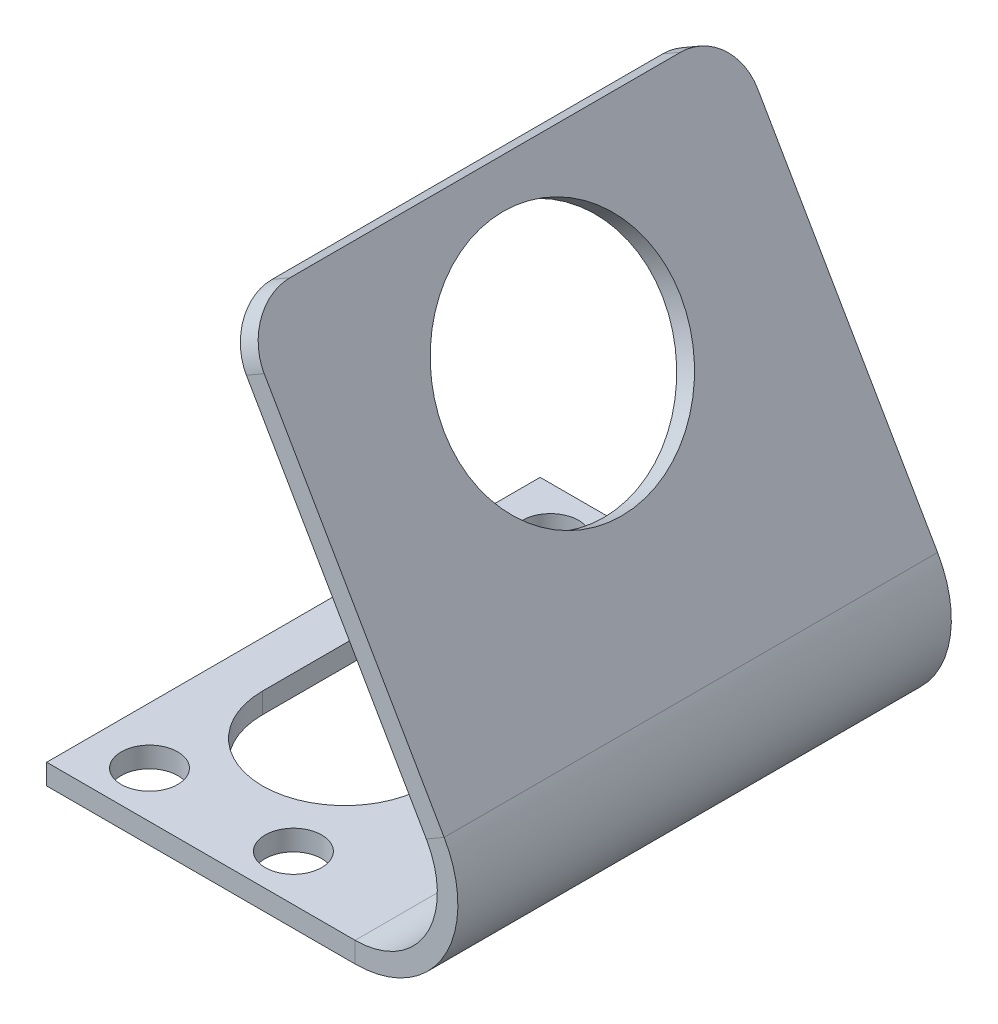
ISO-10303-21;
HEADER;
FILE_DESCRIPTION(('STEP AP214'),'2;1');
FILE_NAME('part.step','',(''),(''),'','','');
FILE_SCHEMA(('AUTOMOTIVE_DESIGN { 1 0 10303 214 1 1 1 1 }'));
ENDSEC;
DATA;
#1=APPLICATION_CONTEXT('core data for automotive mechanical design processes');
#2=APPLICATION_PROTOCOL_DEFINITION('international standard','automotive_design',2000,#1);
#3=PRODUCT_CONTEXT('',#1,'mechanical');
#4=PRODUCT('Part','Part','',(#3));
#5=PRODUCT_RELATED_PRODUCT_CATEGORY('part','',(#4));
#6=PRODUCT_DEFINITION_FORMATION('','',#4);
#7=PRODUCT_DEFINITION_CONTEXT('part definition',#1,'design');
#8=PRODUCT_DEFINITION('design','',#6,#7);
#9=PRODUCT_DEFINITION_SHAPE('','',#8);
#10=(LENGTH_UNIT() NAMED_UNIT(*) SI_UNIT(.MILLI.,.METRE.));
#11=(NAMED_UNIT(*) PLANE_ANGLE_UNIT() SI_UNIT($,.RADIAN.));
#12=(NAMED_UNIT(*) SI_UNIT($,.STERADIAN.) SOLID_ANGLE_UNIT());
#13=UNCERTAINTY_MEASURE_WITH_UNIT(LENGTH_MEASURE(1.E-05),#10,'distance_accuracy_value','');
#14=(GEOMETRIC_REPRESENTATION_CONTEXT(3) GLOBAL_UNCERTAINTY_ASSIGNED_CONTEXT((#13)) GLOBAL_UNIT_ASSIGNED_CONTEXT((#10,
#11,#12)) REPRESENTATION_CONTEXT('',''));
#15=CARTESIAN_POINT('',(0.,0.,0.));
#16=DIRECTION('',(0.,0.,1.));
#17=DIRECTION('',(1.,0.,0.));
#18=AXIS2_PLACEMENT_3D('',#15,#16,#17);
#19=CARTESIAN_POINT('',(0.,0.,24.));
#20=DIRECTION('',(0.,0.,1.));
#21=DIRECTION('',(1.,0.,0.));
#22=AXIS2_PLACEMENT_3D('',#19,#20,#21);
#23=PLANE('',#22);
#24=DIRECTION('',(0.,1.,0.));
#25=VECTOR('',#24,1.);
#26=CARTESIAN_POINT('',(0.,0.,24.));
#27=LINE('',#26,#25);
#28=CARTESIAN_POINT('',(0.,0.,24.));
#29=VERTEX_POINT('',#28);
#30=CARTESIAN_POINT('',(0.,2.,24.));
#31=VERTEX_POINT('',#30);
#32=EDGE_CURVE('E271',#29,#31,#27,.T.);
#33=ORIENTED_EDGE('',*,*,#32,.F.);
#34=CARTESIAN_POINT('',(0.,10.,24.));
#35=DIRECTION('',(0.,0.,1.));
#36=DIRECTION('',(1.,0.,0.));
#37=AXIS2_PLACEMENT_3D('',#34,#35,#36);
#38=CIRCLE('',#37,10.);
#39=CARTESIAN_POINT('',(8.66025403784436,15.,24.));
#40=VERTEX_POINT('',#39);
#41=EDGE_CURVE('E221',#29,#40,#38,.T.);
#42=ORIENTED_EDGE('',*,*,#41,.T.);
#43=DIRECTION('',(0.866025403784436,0.500000000000004,0.));
#44=VECTOR('',#43,1.);
#45=CARTESIAN_POINT('',(6.92820323027549,14.,24.));
#46=LINE('',#45,#44);
#47=CARTESIAN_POINT('',(6.92820323027549,14.,24.));
#48=VERTEX_POINT('',#47);
#49=EDGE_CURVE('E269',#48,#40,#46,.T.);
#50=ORIENTED_EDGE('',*,*,#49,.F.);
#51=CARTESIAN_POINT('',(0.,10.,24.));
#52=DIRECTION('',(0.,0.,1.));
#53=DIRECTION('',(1.,0.,0.));
#54=AXIS2_PLACEMENT_3D('',#51,#52,#53);
#55=CIRCLE('',#54,8.);
#56=EDGE_CURVE('E209',#31,#48,#55,.T.);
#57=ORIENTED_EDGE('',*,*,#56,.F.);
#58=EDGE_LOOP('',(#33,#42,#50,#57));
#59=FACE_BOUND('',#58,.T.);
#60=ADVANCED_FACE('F34',(#59),#23,.T.);
#61=CARTESIAN_POINT('',(6.92820323027549,14.,24.));
#62=DIRECTION('',(0.,0.,1.));
#63=DIRECTION('',(1.,0.,0.));
#64=AXIS2_PLACEMENT_3D('',#61,#62,#63);
#65=PLANE('',#64);
#66=DIRECTION('',(1.,0.,0.));
#67=VECTOR('',#66,1.);
#68=CARTESIAN_POINT('',(-30.,0.,24.));
#69=LINE('',#68,#67);
#70=CARTESIAN_POINT('',(-30.,0.,24.));
#71=VERTEX_POINT('',#70);
#72=EDGE_CURVE('E218',#71,#29,#69,.T.);
#73=ORIENTED_EDGE('',*,*,#72,.T.);
#74=ORIENTED_EDGE('',*,*,#32,.T.);
#75=DIRECTION('',(1.,0.,0.));
#76=VECTOR('',#75,1.);
#77=CARTESIAN_POINT('',(-30.,2.,24.));
#78=LINE('',#77,#76);
#79=CARTESIAN_POINT('',(-30.,2.,24.));
#80=VERTEX_POINT('',#79);
#81=EDGE_CURVE('E212',#80,#31,#78,.T.);
#82=ORIENTED_EDGE('',*,*,#81,.F.);
#83=DIRECTION('',(0.,1.,0.));
#84=VECTOR('',#83,1.);
#85=CARTESIAN_POINT('',(-30.,0.,24.));
#86=LINE('',#85,#84);
#87=EDGE_CURVE('E215',#71,#80,#86,.T.);
#88=ORIENTED_EDGE('',*,*,#87,.F.);
#89=EDGE_LOOP('',(#73,#74,#82,#88));
#90=FACE_BOUND('',#89,.T.);
#91=ADVANCED_FACE('F335',(#90),#65,.T.);
#92=CARTESIAN_POINT('',(8.66025403784436,15.,-24.));
#93=DIRECTION('',(0.,0.,-1.));
#94=DIRECTION('',(-1.,0.,0.));
#95=AXIS2_PLACEMENT_3D('',#92,#93,#94);
#96=PLANE('',#95);
#97=DIRECTION('',(-0.866025403784436,-0.500000000000004,0.));
#98=VECTOR('',#97,1.);
#99=CARTESIAN_POINT('',(8.66025403784436,15.,-24.));
#100=LINE('',#99,#98);
#101=CARTESIAN_POINT('',(8.66025403784436,15.,-24.));
#102=VERTEX_POINT('',#101);
#103=CARTESIAN_POINT('',(6.92820323027549,14.,-24.));
#104=VERTEX_POINT('',#103);
#105=EDGE_CURVE('E267',#102,#104,#100,.T.);
#106=ORIENTED_EDGE('',*,*,#105,.F.);
#107=CARTESIAN_POINT('',(0.,10.,-24.));
#108=DIRECTION('',(0.,0.,1.));
#109=DIRECTION('',(1.,0.,0.));
#110=AXIS2_PLACEMENT_3D('',#107,#108,#109);
#111=CIRCLE('',#110,10.);
#112=CARTESIAN_POINT('',(0.,0.,-24.));
#113=VERTEX_POINT('',#112);
#114=EDGE_CURVE('E206',#113,#102,#111,.T.);
#115=ORIENTED_EDGE('',*,*,#114,.F.);
#116=DIRECTION('',(0.,-1.,0.));
#117=VECTOR('',#116,1.);
#118=CARTESIAN_POINT('',(0.,2.,-24.));
#119=LINE('',#118,#117);
#120=CARTESIAN_POINT('',(0.,2.,-24.));
#121=VERTEX_POINT('',#120);
#122=EDGE_CURVE('E265',#121,#113,#119,.T.);
#123=ORIENTED_EDGE('',*,*,#122,.F.);
#124=CARTESIAN_POINT('',(0.,10.,-24.));
#125=DIRECTION('',(0.,0.,1.));
#126=DIRECTION('',(1.,0.,0.));
#127=AXIS2_PLACEMENT_3D('',#124,#125,#126);
#128=CIRCLE('',#127,8.);
#129=EDGE_CURVE('E230',#121,#104,#128,.T.);
#130=ORIENTED_EDGE('',*,*,#129,.T.);
#131=EDGE_LOOP('',(#106,#115,#123,#130));
#132=FACE_BOUND('',#131,.T.);
#133=ADVANCED_FACE('F321',(#132),#96,.T.);
#134=CARTESIAN_POINT('',(0.,2.,-24.));
#135=DIRECTION('',(0.,0.,-1.));
#136=DIRECTION('',(-1.,0.,0.));
#137=AXIS2_PLACEMENT_3D('',#134,#135,#136);
#138=PLANE('',#137);
#139=DIRECTION('',(-0.500000000000004,0.866025403784436,0.));
#140=VECTOR('',#139,1.);
#141=CARTESIAN_POINT('',(6.92820323027549,14.,-24.));
#142=LINE('',#141,#140);
#143=CARTESIAN_POINT('',(-10.5717967697247,44.3108891324553,-24.));
#144=VERTEX_POINT('',#143);
#145=EDGE_CURVE('E227',#104,#144,#142,.T.);
#146=ORIENTED_EDGE('',*,*,#145,.T.);
#147=DIRECTION('',(0.866025403784436,0.500000000000004,0.));
#148=VECTOR('',#147,1.);
#149=CARTESIAN_POINT('',(-20.9641016151379,38.3108891324552,-24.));
#150=LINE('',#149,#148);
#151=CARTESIAN_POINT('',(-8.83974596215579,45.3108891324553,-24.));
#152=VERTEX_POINT('',#151);
#153=EDGE_CURVE('E273',#144,#152,#150,.T.);
#154=ORIENTED_EDGE('',*,*,#153,.T.);
#155=DIRECTION('',(-0.500000000000004,0.866025403784436,0.));
#156=VECTOR('',#155,1.);
#157=CARTESIAN_POINT('',(8.66025403784436,15.,-24.));
#158=LINE('',#157,#156);
#159=EDGE_CURVE('E201',#102,#152,#158,.T.);
#160=ORIENTED_EDGE('',*,*,#159,.F.);
#161=ORIENTED_EDGE('',*,*,#105,.T.);
#162=EDGE_LOOP('',(#146,#154,#160,#161));
#163=FACE_BOUND('',#162,.T.);
#164=ADVANCED_FACE('F296',(#163),#138,.T.);
#165=CARTESIAN_POINT('',(8.66025403784436,15.,24.));
#166=DIRECTION('',(-0.866025403784436,-0.500000000000004,0.));
#167=DIRECTION('',(0.500000000000004,-0.866025403784436,0.));
#168=AXIS2_PLACEMENT_3D('',#165,#166,#167);
#169=PLANE('',#168);
#170=CARTESIAN_POINT('',(-3.83974596215574,36.650635094611,0.));
#171=DIRECTION('',(0.866025403784436,0.500000000000004,0.));
#172=DIRECTION('',(-0.500000000000004,0.866025403784436,0.));
#173=AXIS2_PLACEMENT_3D('',#170,#171,#172);
#174=CIRCLE('',#173,11.5);
#175=CARTESIAN_POINT('',(-9.58974596215579,46.609927238132,0.));
#176=VERTEX_POINT('',#175);
#177=EDGE_CURVE('E171',#176,#176,#174,.T.);
#178=ORIENTED_EDGE('',*,*,#177,.F.);
#179=EDGE_LOOP('',(#178));
#180=FACE_BOUND('',#179,.T.);
#181=ORIENTED_EDGE('',*,*,#159,.T.);
#182=CARTESIAN_POINT('',(-8.83974596215578,45.3108891324553,-19.));
#183=DIRECTION('',(-0.866025403784436,-0.500000000000004,0.));
#184=DIRECTION('',(0.500000000000004,-0.866025403784436,0.));
#185=AXIS2_PLACEMENT_3D('',#182,#183,#184);
#186=CIRCLE('',#185,5.);
#187=CARTESIAN_POINT('',(-11.3397459621558,49.6410161513775,-19.));
#188=VERTEX_POINT('',#187);
#189=EDGE_CURVE('E278',#152,#188,#186,.F.);
#190=ORIENTED_EDGE('',*,*,#189,.T.);
#191=DIRECTION('',(0.,0.,-1.));
#192=VECTOR('',#191,1.);
#193=CARTESIAN_POINT('',(-11.3397459621558,49.6410161513775,24.));
#194=LINE('',#193,#192);
#195=CARTESIAN_POINT('',(-11.3397459621558,49.6410161513775,19.));
#196=VERTEX_POINT('',#195);
#197=EDGE_CURVE('E262',#196,#188,#194,.T.);
#198=ORIENTED_EDGE('',*,*,#197,.F.);
#199=CARTESIAN_POINT('',(-8.83974596215579,45.3108891324553,19.));
#200=DIRECTION('',(-0.866025403784436,-0.500000000000004,0.));
#201=DIRECTION('',(0.500000000000004,-0.866025403784436,0.));
#202=AXIS2_PLACEMENT_3D('',#199,#200,#201);
#203=CIRCLE('',#202,5.);
#204=CARTESIAN_POINT('',(-8.83974596215579,45.3108891324553,24.));
#205=VERTEX_POINT('',#204);
#206=EDGE_CURVE('E276',#196,#205,#203,.F.);
#207=ORIENTED_EDGE('',*,*,#206,.T.);
#208=DIRECTION('',(-0.500000000000004,0.866025403784436,0.));
#209=VECTOR('',#208,1.);
#210=CARTESIAN_POINT('',(8.66025403784436,15.,24.));
#211=LINE('',#210,#209);
#212=EDGE_CURVE('E202',#40,#205,#211,.T.);
#213=ORIENTED_EDGE('',*,*,#212,.F.);
#214=DIRECTION('',(0.,0.,-1.));
#215=VECTOR('',#214,1.);
#216=CARTESIAN_POINT('',(8.66025403784436,15.,24.));
#217=LINE('',#216,#215);
#218=EDGE_CURVE('E224',#40,#102,#217,.T.);
#219=ORIENTED_EDGE('',*,*,#218,.T.);
#220=EDGE_LOOP('',(#181,#190,#198,#207,#213,#219));
#221=FACE_BOUND('',#220,.T.);
#222=ADVANCED_FACE('F301',(#180,#221),#169,.F.);
#223=CARTESIAN_POINT('',(-13.0717967697247,48.6410161513775,24.));
#224=DIRECTION('',(-0.500000000000004,0.866025403784436,0.));
#225=DIRECTION('',(-0.866025403784436,-0.500000000000004,0.));
#226=AXIS2_PLACEMENT_3D('',#223,#224,#225);
#227=PLANE('',#226);
#228=ORIENTED_EDGE('',*,*,#197,.T.);
#229=DIRECTION('',(0.866025403784436,0.500000000000004,0.));
#230=VECTOR('',#229,1.);
#231=CARTESIAN_POINT('',(-13.0717967697247,48.6410161513775,-19.));
#232=LINE('',#231,#230);
#233=CARTESIAN_POINT('',(-13.0717967697247,48.6410161513775,-19.));
#234=VERTEX_POINT('',#233);
#235=EDGE_CURVE('E283',#188,#234,#232,.F.);
#236=ORIENTED_EDGE('',*,*,#235,.T.);
#237=DIRECTION('',(0.,0.,-1.));
#238=VECTOR('',#237,1.);
#239=CARTESIAN_POINT('',(-13.0717967697247,48.6410161513775,24.));
#240=LINE('',#239,#238);
#241=CARTESIAN_POINT('',(-13.0717967697247,48.6410161513775,19.));
#242=VERTEX_POINT('',#241);
#243=EDGE_CURVE('E259',#242,#234,#240,.T.);
#244=ORIENTED_EDGE('',*,*,#243,.F.);
#245=DIRECTION('',(0.866025403784436,0.500000000000004,0.));
#246=VECTOR('',#245,1.);
#247=CARTESIAN_POINT('',(-13.0717967697247,48.6410161513775,19.));
#248=LINE('',#247,#246);
#249=EDGE_CURVE('E280',#242,#196,#248,.T.);
#250=ORIENTED_EDGE('',*,*,#249,.T.);
#251=EDGE_LOOP('',(#228,#236,#244,#250));
#252=FACE_BOUND('',#251,.T.);
#253=ADVANCED_FACE('F303',(#252),#227,.T.);
#254=CARTESIAN_POINT('',(6.92820323027549,14.,24.));
#255=DIRECTION('',(-0.866025403784436,-0.500000000000004,0.));
#256=DIRECTION('',(0.500000000000004,-0.866025403784436,0.));
#257=AXIS2_PLACEMENT_3D('',#254,#255,#256);
#258=PLANE('',#257);
#259=CARTESIAN_POINT('',(-5.57179676972462,35.6506350946109,0.));
#260=DIRECTION('',(-0.866025403784436,-0.500000000000004,0.));
#261=DIRECTION('',(0.500000000000004,-0.866025403784436,0.));
#262=AXIS2_PLACEMENT_3D('',#259,#260,#261);
#263=CIRCLE('',#262,11.5);
#264=CARTESIAN_POINT('',(0.178203230275432,25.6913429510899,0.));
#265=VERTEX_POINT('',#264);
#266=EDGE_CURVE('E174',#265,#265,#263,.F.);
#267=ORIENTED_EDGE('',*,*,#266,.T.);
#268=EDGE_LOOP('',(#267));
#269=FACE_BOUND('',#268,.T.);
#270=ORIENTED_EDGE('',*,*,#243,.T.);
#271=CARTESIAN_POINT('',(-10.5717967697247,44.3108891324553,-19.));
#272=DIRECTION('',(-0.866025403784436,-0.500000000000004,0.));
#273=DIRECTION('',(0.500000000000004,-0.866025403784436,0.));
#274=AXIS2_PLACEMENT_3D('',#271,#272,#273);
#275=CIRCLE('',#274,5.);
#276=EDGE_CURVE('E42',#234,#144,#275,.T.);
#277=ORIENTED_EDGE('',*,*,#276,.T.);
#278=ORIENTED_EDGE('',*,*,#145,.F.);
#279=DIRECTION('',(0.,0.,-1.));
#280=VECTOR('',#279,1.);
#281=CARTESIAN_POINT('',(6.92820323027549,14.,24.));
#282=LINE('',#281,#280);
#283=EDGE_CURVE('E256',#48,#104,#282,.T.);
#284=ORIENTED_EDGE('',*,*,#283,.F.);
#285=DIRECTION('',(-0.500000000000004,0.866025403784436,0.));
#286=VECTOR('',#285,1.);
#287=CARTESIAN_POINT('',(6.92820323027549,14.,24.));
#288=LINE('',#287,#286);
#289=CARTESIAN_POINT('',(-10.5717967697247,44.3108891324553,24.));
#290=VERTEX_POINT('',#289);
#291=EDGE_CURVE('E205',#48,#290,#288,.T.);
#292=ORIENTED_EDGE('',*,*,#291,.T.);
#293=CARTESIAN_POINT('',(-10.5717967697247,44.3108891324553,19.));
#294=DIRECTION('',(-0.866025403784436,-0.500000000000004,0.));
#295=DIRECTION('',(0.500000000000004,-0.866025403784436,0.));
#296=AXIS2_PLACEMENT_3D('',#293,#294,#295);
#297=CIRCLE('',#296,5.);
#298=EDGE_CURVE('E285',#290,#242,#297,.T.);
#299=ORIENTED_EDGE('',*,*,#298,.T.);
#300=EDGE_LOOP('',(#270,#277,#278,#284,#292,#299));
#301=FACE_BOUND('',#300,.T.);
#302=ADVANCED_FACE('F289',(#269,#301),#258,.T.);
#303=CARTESIAN_POINT('',(0.,10.,24.));
#304=DIRECTION('',(0.,0.,-1.));
#305=DIRECTION('',(-1.,0.,0.));
#306=AXIS2_PLACEMENT_3D('',#303,#304,#305);
#307=CYLINDRICAL_SURFACE('',#306,8.);
#308=ORIENTED_EDGE('',*,*,#129,.F.);
#309=DIRECTION('',(0.,0.,-1.));
#310=VECTOR('',#309,1.);
#311=CARTESIAN_POINT('',(0.,2.,24.));
#312=LINE('',#311,#310);
#313=EDGE_CURVE('E253',#31,#121,#312,.T.);
#314=ORIENTED_EDGE('',*,*,#313,.F.);
#315=ORIENTED_EDGE('',*,*,#56,.T.);
#316=ORIENTED_EDGE('',*,*,#283,.T.);
#317=EDGE_LOOP('',(#308,#314,#315,#316));
#318=FACE_BOUND('',#317,.T.);
#319=ADVANCED_FACE('F325',(#318),#307,.F.);
#320=CARTESIAN_POINT('',(-30.,2.,24.));
#321=DIRECTION('',(0.,1.,0.));
#322=DIRECTION('',(0.,0.,1.));
#323=AXIS2_PLACEMENT_3D('',#320,#321,#322);
#324=PLANE('',#323);
#325=DIRECTION('',(0.,0.,-1.));
#326=VECTOR('',#325,1.);
#327=CARTESIAN_POINT('',(-25.5,2.,7.5));
#328=LINE('',#327,#326);
#329=CARTESIAN_POINT('',(-25.5,2.,7.5));
#330=VERTEX_POINT('',#329);
#331=CARTESIAN_POINT('',(-25.5,2.,-7.5));
#332=VERTEX_POINT('',#331);
#333=EDGE_CURVE('E148',#330,#332,#328,.T.);
#334=ORIENTED_EDGE('',*,*,#333,.T.);
#335=CARTESIAN_POINT('',(-17.5,2.,-7.5));
#336=DIRECTION('',(0.,1.,0.));
#337=DIRECTION('',(0.,0.,1.));
#338=AXIS2_PLACEMENT_3D('',#335,#336,#337);
#339=CIRCLE('',#338,7.99999999999999);
#340=CARTESIAN_POINT('',(-9.50000000000001,2.,-7.5));
#341=VERTEX_POINT('',#340);
#342=EDGE_CURVE('E135',#332,#341,#339,.F.);
#343=ORIENTED_EDGE('',*,*,#342,.T.);
#344=DIRECTION('',(0.,0.,1.));
#345=VECTOR('',#344,1.);
#346=CARTESIAN_POINT('',(-9.50000000000001,2.,7.5));
#347=LINE('',#346,#345);
#348=CARTESIAN_POINT('',(-9.50000000000001,2.,7.5));
#349=VERTEX_POINT('',#348);
#350=EDGE_CURVE('E166',#341,#349,#347,.T.);
#351=ORIENTED_EDGE('',*,*,#350,.T.);
#352=CARTESIAN_POINT('',(-17.5,2.,7.5));
#353=DIRECTION('',(0.,1.,0.));
#354=DIRECTION('',(0.,0.,1.));
#355=AXIS2_PLACEMENT_3D('',#352,#353,#354);
#356=CIRCLE('',#355,7.99999999999999);
#357=EDGE_CURVE('E156',#349,#330,#356,.F.);
#358=ORIENTED_EDGE('',*,*,#357,.T.);
#359=EDGE_LOOP('',(#334,#343,#351,#358));
#360=FACE_BOUND('',#359,.T.);
#361=CARTESIAN_POINT('',(-24.5,2.,-19.5));
#362=DIRECTION('',(0.,1.,0.));
#363=DIRECTION('',(0.,0.,1.));
#364=AXIS2_PLACEMENT_3D('',#361,#362,#363);
#365=CIRCLE('',#364,2.75);
#366=CARTESIAN_POINT('',(-24.5,2.,-16.75));
#367=VERTEX_POINT('',#366);
#368=EDGE_CURVE('E180',#367,#367,#365,.F.);
#369=ORIENTED_EDGE('',*,*,#368,.T.);
#370=EDGE_LOOP('',(#369));
#371=FACE_BOUND('',#370,.T.);
#372=CARTESIAN_POINT('',(-10.5,2.,-19.5));
#373=DIRECTION('',(0.,1.,0.));
#374=DIRECTION('',(0.,0.,1.));
#375=AXIS2_PLACEMENT_3D('',#372,#373,#374);
#376=CIRCLE('',#375,2.75);
#377=CARTESIAN_POINT('',(-10.5,2.,-16.75));
#378=VERTEX_POINT('',#377);
#379=EDGE_CURVE('E186',#378,#378,#376,.F.);
#380=ORIENTED_EDGE('',*,*,#379,.T.);
#381=EDGE_LOOP('',(#380));
#382=FACE_BOUND('',#381,.T.);
#383=CARTESIAN_POINT('',(-10.5,2.,19.5));
#384=DIRECTION('',(0.,1.,0.));
#385=DIRECTION('',(0.,0.,1.));
#386=AXIS2_PLACEMENT_3D('',#383,#384,#385);
#387=CIRCLE('',#386,2.75);
#388=CARTESIAN_POINT('',(-10.5,2.,22.25));
#389=VERTEX_POINT('',#388);
#390=EDGE_CURVE('E192',#389,#389,#387,.F.);
#391=ORIENTED_EDGE('',*,*,#390,.T.);
#392=EDGE_LOOP('',(#391));
#393=FACE_BOUND('',#392,.T.);
#394=CARTESIAN_POINT('',(-24.5,2.,19.5));
#395=DIRECTION('',(0.,1.,0.));
#396=DIRECTION('',(0.,0.,1.));
#397=AXIS2_PLACEMENT_3D('',#394,#395,#396);
#398=CIRCLE('',#397,2.75);
#399=CARTESIAN_POINT('',(-24.5,2.,22.25));
#400=VERTEX_POINT('',#399);
#401=EDGE_CURVE('E198',#400,#400,#398,.F.);
#402=ORIENTED_EDGE('',*,*,#401,.T.);
#403=EDGE_LOOP('',(#402));
#404=FACE_BOUND('',#403,.T.);
#405=DIRECTION('',(1.,0.,0.));
#406=VECTOR('',#405,1.);
#407=CARTESIAN_POINT('',(-30.,2.,-24.));
#408=LINE('',#407,#406);
#409=CARTESIAN_POINT('',(-30.,2.,-24.));
#410=VERTEX_POINT('',#409);
#411=EDGE_CURVE('E233',#410,#121,#408,.T.);
#412=ORIENTED_EDGE('',*,*,#411,.F.);
#413=DIRECTION('',(0.,0.,-1.));
#414=VECTOR('',#413,1.);
#415=CARTESIAN_POINT('',(-30.,2.,24.));
#416=LINE('',#415,#414);
#417=EDGE_CURVE('E251',#80,#410,#416,.T.);
#418=ORIENTED_EDGE('',*,*,#417,.F.);
#419=ORIENTED_EDGE('',*,*,#81,.T.);
#420=ORIENTED_EDGE('',*,*,#313,.T.);
#421=EDGE_LOOP('',(#412,#418,#419,#420));
#422=FACE_BOUND('',#421,.T.);
#423=ADVANCED_FACE('F154',(#360,#371,#382,#393,#404,#422),#324,.T.);
#424=CARTESIAN_POINT('',(-30.,0.,24.));
#425=DIRECTION('',(-1.,0.,0.));
#426=DIRECTION('',(0.,0.,1.));
#427=AXIS2_PLACEMENT_3D('',#424,#425,#426);
#428=PLANE('',#427);
#429=DIRECTION('',(0.,1.,0.));
#430=VECTOR('',#429,1.);
#431=CARTESIAN_POINT('',(-30.,0.,-24.));
#432=LINE('',#431,#430);
#433=CARTESIAN_POINT('',(-30.,0.,-24.));
#434=VERTEX_POINT('',#433);
#435=EDGE_CURVE('E236',#434,#410,#432,.T.);
#436=ORIENTED_EDGE('',*,*,#435,.F.);
#437=DIRECTION('',(0.,0.,-1.));
#438=VECTOR('',#437,1.);
#439=CARTESIAN_POINT('',(-30.,0.,24.));
#440=LINE('',#439,#438);
#441=EDGE_CURVE('E249',#71,#434,#440,.T.);
#442=ORIENTED_EDGE('',*,*,#441,.F.);
#443=ORIENTED_EDGE('',*,*,#87,.T.);
#444=ORIENTED_EDGE('',*,*,#417,.T.);
#445=EDGE_LOOP('',(#436,#442,#443,#444));
#446=FACE_BOUND('',#445,.T.);
#447=ADVANCED_FACE('F337',(#446),#428,.T.);
#448=CARTESIAN_POINT('',(-30.,0.,24.));
#449=DIRECTION('',(0.,1.,0.));
#450=DIRECTION('',(0.,0.,1.));
#451=AXIS2_PLACEMENT_3D('',#448,#449,#450);
#452=PLANE('',#451);
#453=CARTESIAN_POINT('',(-17.5,0.,-7.5));
#454=DIRECTION('',(0.,-1.,0.));
#455=DIRECTION('',(0.,0.,-1.));
#456=AXIS2_PLACEMENT_3D('',#453,#454,#455);
#457=CIRCLE('',#456,7.99999999999999);
#458=CARTESIAN_POINT('',(-25.5,0.,-7.5));
#459=VERTEX_POINT('',#458);
#460=CARTESIAN_POINT('',(-9.50000000000001,0.,-7.5));
#461=VERTEX_POINT('',#460);
#462=EDGE_CURVE('E158',#459,#461,#457,.T.);
#463=ORIENTED_EDGE('',*,*,#462,.F.);
#464=DIRECTION('',(0.,0.,-1.));
#465=VECTOR('',#464,1.);
#466=CARTESIAN_POINT('',(-25.5,0.,7.5));
#467=LINE('',#466,#465);
#468=CARTESIAN_POINT('',(-25.5,0.,7.5));
#469=VERTEX_POINT('',#468);
#470=EDGE_CURVE('E151',#469,#459,#467,.T.);
#471=ORIENTED_EDGE('',*,*,#470,.F.);
#472=CARTESIAN_POINT('',(-17.5,0.,7.5));
#473=DIRECTION('',(0.,-1.,0.));
#474=DIRECTION('',(0.,0.,-1.));
#475=AXIS2_PLACEMENT_3D('',#472,#473,#474);
#476=CIRCLE('',#475,7.99999999999999);
#477=CARTESIAN_POINT('',(-9.50000000000001,0.,7.5));
#478=VERTEX_POINT('',#477);
#479=EDGE_CURVE('E162',#478,#469,#476,.T.);
#480=ORIENTED_EDGE('',*,*,#479,.F.);
#481=DIRECTION('',(0.,0.,1.));
#482=VECTOR('',#481,1.);
#483=CARTESIAN_POINT('',(-9.50000000000001,0.,7.5));
#484=LINE('',#483,#482);
#485=EDGE_CURVE('E57',#461,#478,#484,.T.);
#486=ORIENTED_EDGE('',*,*,#485,.F.);
#487=EDGE_LOOP('',(#463,#471,#480,#486));
#488=FACE_BOUND('',#487,.T.);
#489=CARTESIAN_POINT('',(-24.5,0.,-19.5));
#490=DIRECTION('',(0.,-1.,0.));
#491=DIRECTION('',(0.,0.,1.));
#492=AXIS2_PLACEMENT_3D('',#489,#490,#491);
#493=CIRCLE('',#492,2.75);
#494=CARTESIAN_POINT('',(-24.5,0.,-16.75));
#495=VERTEX_POINT('',#494);
#496=EDGE_CURVE('E177',#495,#495,#493,.T.);
#497=ORIENTED_EDGE('',*,*,#496,.F.);
#498=EDGE_LOOP('',(#497));
#499=FACE_BOUND('',#498,.T.);
#500=CARTESIAN_POINT('',(-10.5,0.,-19.5));
#501=DIRECTION('',(0.,-1.,0.));
#502=DIRECTION('',(0.,0.,1.));
#503=AXIS2_PLACEMENT_3D('',#500,#501,#502);
#504=CIRCLE('',#503,2.75);
#505=CARTESIAN_POINT('',(-10.5,0.,-16.75));
#506=VERTEX_POINT('',#505);
#507=EDGE_CURVE('E183',#506,#506,#504,.T.);
#508=ORIENTED_EDGE('',*,*,#507,.F.);
#509=EDGE_LOOP('',(#508));
#510=FACE_BOUND('',#509,.T.);
#511=CARTESIAN_POINT('',(-10.5,0.,19.5));
#512=DIRECTION('',(0.,-1.,0.));
#513=DIRECTION('',(0.,0.,-1.));
#514=AXIS2_PLACEMENT_3D('',#511,#512,#513);
#515=CIRCLE('',#514,2.75);
#516=CARTESIAN_POINT('',(-10.5,0.,16.75));
#517=VERTEX_POINT('',#516);
#518=EDGE_CURVE('E189',#517,#517,#515,.T.);
#519=ORIENTED_EDGE('',*,*,#518,.F.);
#520=EDGE_LOOP('',(#519));
#521=FACE_BOUND('',#520,.T.);
#522=CARTESIAN_POINT('',(-24.5,0.,19.5));
#523=DIRECTION('',(0.,-1.,0.));
#524=DIRECTION('',(0.,0.,-1.));
#525=AXIS2_PLACEMENT_3D('',#522,#523,#524);
#526=CIRCLE('',#525,2.75);
#527=CARTESIAN_POINT('',(-24.5,0.,16.75));
#528=VERTEX_POINT('',#527);
#529=EDGE_CURVE('E195',#528,#528,#526,.T.);
#530=ORIENTED_EDGE('',*,*,#529,.F.);
#531=EDGE_LOOP('',(#530));
#532=FACE_BOUND('',#531,.T.);
#533=DIRECTION('',(1.,0.,0.));
#534=VECTOR('',#533,1.);
#535=CARTESIAN_POINT('',(-30.,0.,-24.));
#536=LINE('',#535,#534);
#537=EDGE_CURVE('E239',#434,#113,#536,.T.);
#538=ORIENTED_EDGE('',*,*,#537,.T.);
#539=DIRECTION('',(0.,0.,-1.));
#540=VECTOR('',#539,1.);
#541=CARTESIAN_POINT('',(0.,0.,24.));
#542=LINE('',#541,#540);
#543=EDGE_CURVE('E246',#29,#113,#542,.T.);
#544=ORIENTED_EDGE('',*,*,#543,.F.);
#545=ORIENTED_EDGE('',*,*,#72,.F.);
#546=ORIENTED_EDGE('',*,*,#441,.T.);
#547=EDGE_LOOP('',(#538,#544,#545,#546));
#548=FACE_BOUND('',#547,.T.);
#549=ADVANCED_FACE('F340',(#488,#499,#510,#521,#532,#548),#452,.F.);
#550=CARTESIAN_POINT('',(0.,10.,24.));
#551=DIRECTION('',(0.,0.,-1.));
#552=DIRECTION('',(-1.,0.,0.));
#553=AXIS2_PLACEMENT_3D('',#550,#551,#552);
#554=CYLINDRICAL_SURFACE('',#553,10.);
#555=ORIENTED_EDGE('',*,*,#114,.T.);
#556=ORIENTED_EDGE('',*,*,#218,.F.);
#557=ORIENTED_EDGE('',*,*,#41,.F.);
#558=ORIENTED_EDGE('',*,*,#543,.T.);
#559=EDGE_LOOP('',(#555,#556,#557,#558));
#560=FACE_BOUND('',#559,.T.);
#561=ADVANCED_FACE('F317',(#560),#554,.T.);
#562=CARTESIAN_POINT('',(0.,10.,24.));
#563=DIRECTION('',(0.,0.,1.));
#564=DIRECTION('',(1.,0.,0.));
#565=AXIS2_PLACEMENT_3D('',#562,#563,#564);
#566=PLANE('',#565);
#567=ORIENTED_EDGE('',*,*,#212,.T.);
#568=DIRECTION('',(0.866025403784436,0.500000000000004,0.));
#569=VECTOR('',#568,1.);
#570=CARTESIAN_POINT('',(-17.5000000000001,40.3108891324553,24.));
#571=LINE('',#570,#569);
#572=EDGE_CURVE('E11',#205,#290,#571,.F.);
#573=ORIENTED_EDGE('',*,*,#572,.T.);
#574=ORIENTED_EDGE('',*,*,#291,.F.);
#575=ORIENTED_EDGE('',*,*,#49,.T.);
#576=EDGE_LOOP('',(#567,#573,#574,#575));
#577=FACE_BOUND('',#576,.T.);
#578=ADVANCED_FACE('F310',(#577),#566,.T.);
#579=CARTESIAN_POINT('',(0.,10.,-24.));
#580=DIRECTION('',(0.,0.,1.));
#581=DIRECTION('',(1.,0.,0.));
#582=AXIS2_PLACEMENT_3D('',#579,#580,#581);
#583=PLANE('',#582);
#584=ORIENTED_EDGE('',*,*,#411,.T.);
#585=ORIENTED_EDGE('',*,*,#122,.T.);
#586=ORIENTED_EDGE('',*,*,#537,.F.);
#587=ORIENTED_EDGE('',*,*,#435,.T.);
#588=EDGE_LOOP('',(#584,#585,#586,#587));
#589=FACE_BOUND('',#588,.T.);
#590=ADVANCED_FACE('F328',(#589),#583,.F.);
#591=CARTESIAN_POINT('',(-24.5,9.77817459305203,19.5));
#592=DIRECTION('',(0.,-1.,0.));
#593=DIRECTION('',(0.,0.,-1.));
#594=AXIS2_PLACEMENT_3D('',#591,#592,#593);
#595=CYLINDRICAL_SURFACE('',#594,2.75);
#596=ORIENTED_EDGE('',*,*,#529,.T.);
#597=EDGE_LOOP('',(#596));
#598=FACE_BOUND('',#597,.T.);
#599=ORIENTED_EDGE('',*,*,#401,.F.);
#600=EDGE_LOOP('',(#599));
#601=FACE_BOUND('',#600,.T.);
#602=ADVANCED_FACE('F383',(#598,#601),#595,.F.);
#603=CARTESIAN_POINT('',(-10.5,9.77817459305203,19.5));
#604=DIRECTION('',(0.,-1.,0.));
#605=DIRECTION('',(0.,0.,-1.));
#606=AXIS2_PLACEMENT_3D('',#603,#604,#605);
#607=CYLINDRICAL_SURFACE('',#606,2.75);
#608=ORIENTED_EDGE('',*,*,#518,.T.);
#609=EDGE_LOOP('',(#608));
#610=FACE_BOUND('',#609,.T.);
#611=ORIENTED_EDGE('',*,*,#390,.F.);
#612=EDGE_LOOP('',(#611));
#613=FACE_BOUND('',#612,.T.);
#614=ADVANCED_FACE('F379',(#610,#613),#607,.F.);
#615=CARTESIAN_POINT('',(-10.5,9.77817459305203,-19.5));
#616=DIRECTION('',(0.,-1.,0.));
#617=DIRECTION('',(0.,0.,-1.));
#618=AXIS2_PLACEMENT_3D('',#615,#616,#617);
#619=CYLINDRICAL_SURFACE('',#618,2.75);
#620=ORIENTED_EDGE('',*,*,#507,.T.);
#621=EDGE_LOOP('',(#620));
#622=FACE_BOUND('',#621,.T.);
#623=ORIENTED_EDGE('',*,*,#379,.F.);
#624=EDGE_LOOP('',(#623));
#625=FACE_BOUND('',#624,.T.);
#626=ADVANCED_FACE('F370',(#622,#625),#619,.F.);
#627=CARTESIAN_POINT('',(-24.5,9.77817459305203,-19.5));
#628=DIRECTION('',(0.,-1.,0.));
#629=DIRECTION('',(0.,0.,-1.));
#630=AXIS2_PLACEMENT_3D('',#627,#628,#629);
#631=CYLINDRICAL_SURFACE('',#630,2.75);
#632=ORIENTED_EDGE('',*,*,#496,.T.);
#633=EDGE_LOOP('',(#632));
#634=FACE_BOUND('',#633,.T.);
#635=ORIENTED_EDGE('',*,*,#368,.F.);
#636=EDGE_LOOP('',(#635));
#637=FACE_BOUND('',#636,.T.);
#638=ADVANCED_FACE('F364',(#634,#637),#631,.F.);
#639=CARTESIAN_POINT('',(-33.7409288117311,19.3871791273202,0.));
#640=DIRECTION('',(0.866025403784436,0.500000000000004,0.));
#641=DIRECTION('',(-0.500000000000004,0.866025403784436,0.));
#642=AXIS2_PLACEMENT_3D('',#639,#640,#641);
#643=CYLINDRICAL_SURFACE('',#642,11.5);
#644=ORIENTED_EDGE('',*,*,#177,.T.);
#645=EDGE_LOOP('',(#644));
#646=FACE_BOUND('',#645,.T.);
#647=ORIENTED_EDGE('',*,*,#266,.F.);
#648=EDGE_LOOP('',(#647));
#649=FACE_BOUND('',#648,.T.);
#650=ADVANCED_FACE('F359',(#646,#649),#643,.F.);
#651=CARTESIAN_POINT('',(-20.9641016151379,38.3108891324552,-19.));
#652=DIRECTION('',(0.866025403784436,0.500000000000004,0.));
#653=DIRECTION('',(-0.500000000000004,0.866025403784436,0.));
#654=AXIS2_PLACEMENT_3D('',#651,#652,#653);
#655=CYLINDRICAL_SURFACE('',#654,5.);
#656=ORIENTED_EDGE('',*,*,#276,.F.);
#657=ORIENTED_EDGE('',*,*,#235,.F.);
#658=ORIENTED_EDGE('',*,*,#189,.F.);
#659=ORIENTED_EDGE('',*,*,#153,.F.);
#660=EDGE_LOOP('',(#656,#657,#658,#659));
#661=FACE_BOUND('',#660,.T.);
#662=ADVANCED_FACE('F298',(#661),#655,.T.);
#663=CARTESIAN_POINT('',(-10.5717967697247,44.3108891324553,19.));
#664=DIRECTION('',(0.866025403784436,0.500000000000004,0.));
#665=DIRECTION('',(-0.500000000000004,0.866025403784436,0.));
#666=AXIS2_PLACEMENT_3D('',#663,#664,#665);
#667=CYLINDRICAL_SURFACE('',#666,5.);
#668=ORIENTED_EDGE('',*,*,#298,.F.);
#669=ORIENTED_EDGE('',*,*,#572,.F.);
#670=ORIENTED_EDGE('',*,*,#206,.F.);
#671=ORIENTED_EDGE('',*,*,#249,.F.);
#672=EDGE_LOOP('',(#668,#669,#670,#671));
#673=FACE_BOUND('',#672,.T.);
#674=ADVANCED_FACE('F36',(#673),#667,.T.);
#675=CARTESIAN_POINT('',(-25.5,36.8855270850248,7.5));
#676=DIRECTION('',(-1.,0.,0.));
#677=DIRECTION('',(0.,0.,1.));
#678=AXIS2_PLACEMENT_3D('',#675,#676,#677);
#679=PLANE('',#678);
#680=DIRECTION('',(0.,-1.,0.));
#681=VECTOR('',#680,1.);
#682=CARTESIAN_POINT('',(-25.5,36.8855270850248,7.5));
#683=LINE('',#682,#681);
#684=EDGE_CURVE('E49',#330,#469,#683,.T.);
#685=ORIENTED_EDGE('',*,*,#684,.T.);
#686=ORIENTED_EDGE('',*,*,#470,.T.);
#687=DIRECTION('',(0.,-1.,0.));
#688=VECTOR('',#687,1.);
#689=CARTESIAN_POINT('',(-25.5,36.8855270850248,-7.5));
#690=LINE('',#689,#688);
#691=EDGE_CURVE('E139',#332,#459,#690,.T.);
#692=ORIENTED_EDGE('',*,*,#691,.F.);
#693=ORIENTED_EDGE('',*,*,#333,.F.);
#694=EDGE_LOOP('',(#685,#686,#692,#693));
#695=FACE_BOUND('',#694,.T.);
#696=ADVANCED_FACE('F147',(#695),#679,.F.);
#697=CARTESIAN_POINT('',(-17.5,36.8855270850248,-7.5));
#698=DIRECTION('',(0.,-1.,0.));
#699=DIRECTION('',(0.,0.,-1.));
#700=AXIS2_PLACEMENT_3D('',#697,#698,#699);
#701=CYLINDRICAL_SURFACE('',#700,7.99999999999999);
#702=ORIENTED_EDGE('',*,*,#691,.T.);
#703=ORIENTED_EDGE('',*,*,#462,.T.);
#704=DIRECTION('',(0.,-1.,0.));
#705=VECTOR('',#704,1.);
#706=CARTESIAN_POINT('',(-9.50000000000001,36.8855270850248,-7.5));
#707=LINE('',#706,#705);
#708=EDGE_CURVE('E141',#341,#461,#707,.T.);
#709=ORIENTED_EDGE('',*,*,#708,.F.);
#710=ORIENTED_EDGE('',*,*,#342,.F.);
#711=EDGE_LOOP('',(#702,#703,#709,#710));
#712=FACE_BOUND('',#711,.T.);
#713=ADVANCED_FACE('F137',(#712),#701,.F.);
#714=CARTESIAN_POINT('',(-9.50000000000001,36.8855270850248,7.5));
#715=DIRECTION('',(1.,0.,0.));
#716=DIRECTION('',(0.,0.,-1.));
#717=AXIS2_PLACEMENT_3D('',#714,#715,#716);
#718=PLANE('',#717);
#719=ORIENTED_EDGE('',*,*,#708,.T.);
#720=ORIENTED_EDGE('',*,*,#485,.T.);
#721=DIRECTION('',(0.,-1.,0.));
#722=VECTOR('',#721,1.);
#723=CARTESIAN_POINT('',(-9.50000000000001,36.8855270850248,7.5));
#724=LINE('',#723,#722);
#725=EDGE_CURVE('E165',#349,#478,#724,.T.);
#726=ORIENTED_EDGE('',*,*,#725,.F.);
#727=ORIENTED_EDGE('',*,*,#350,.F.);
#728=EDGE_LOOP('',(#719,#720,#726,#727));
#729=FACE_BOUND('',#728,.T.);
#730=ADVANCED_FACE('F505',(#729),#718,.F.);
#731=CARTESIAN_POINT('',(-17.5,36.8855270850248,7.5));
#732=DIRECTION('',(0.,-1.,0.));
#733=DIRECTION('',(0.,0.,-1.));
#734=AXIS2_PLACEMENT_3D('',#731,#732,#733);
#735=CYLINDRICAL_SURFACE('',#734,7.99999999999999);
#736=ORIENTED_EDGE('',*,*,#725,.T.);
#737=ORIENTED_EDGE('',*,*,#479,.T.);
#738=ORIENTED_EDGE('',*,*,#684,.F.);
#739=ORIENTED_EDGE('',*,*,#357,.F.);
#740=EDGE_LOOP('',(#736,#737,#738,#739));
#741=FACE_BOUND('',#740,.T.);
#742=ADVANCED_FACE('F513',(#741),#735,.F.);
#743=CLOSED_SHELL('',(#60,#91,#133,#164,#222,#253,#302,#319,#423,#447,#549,#561,#578,#590,#602,
#614,#626,#638,#650,#662,#674,#696,#713,#730,#742));
#744=MANIFOLD_SOLID_BREP('B2',#743);
#745=ADVANCED_BREP_SHAPE_REPRESENTATION('',(#18,#744),#14);
#746=SHAPE_DEFINITION_REPRESENTATION(#9,#745);
ENDSEC;
END-ISO-10303-21;
